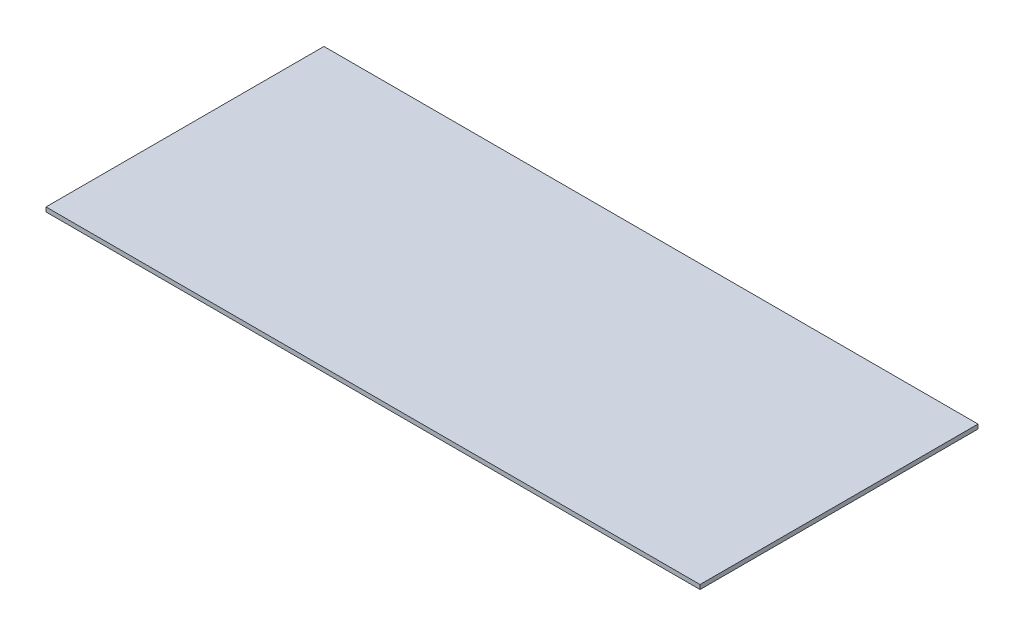
ISO-10303-21;
HEADER;
FILE_DESCRIPTION(('STEP AP214'),'2;1');
FILE_NAME('part.step','',(''),(''),'','','');
FILE_SCHEMA(('AUTOMOTIVE_DESIGN { 1 0 10303 214 1 1 1 1 }'));
ENDSEC;
DATA;
#1=APPLICATION_CONTEXT('core data for automotive mechanical design processes');
#2=APPLICATION_PROTOCOL_DEFINITION('international standard','automotive_design',2000,#1);
#3=PRODUCT_CONTEXT('',#1,'mechanical');
#4=PRODUCT('Part','Part','',(#3));
#5=PRODUCT_RELATED_PRODUCT_CATEGORY('part','',(#4));
#6=PRODUCT_DEFINITION_FORMATION('','',#4);
#7=PRODUCT_DEFINITION_CONTEXT('part definition',#1,'design');
#8=PRODUCT_DEFINITION('design','',#6,#7);
#9=PRODUCT_DEFINITION_SHAPE('','',#8);
#10=(LENGTH_UNIT() NAMED_UNIT(*) SI_UNIT(.MILLI.,.METRE.));
#11=(NAMED_UNIT(*) PLANE_ANGLE_UNIT() SI_UNIT($,.RADIAN.));
#12=(NAMED_UNIT(*) SI_UNIT($,.STERADIAN.) SOLID_ANGLE_UNIT());
#13=UNCERTAINTY_MEASURE_WITH_UNIT(LENGTH_MEASURE(1.E-05),#10,'distance_accuracy_value','');
#14=(GEOMETRIC_REPRESENTATION_CONTEXT(3) GLOBAL_UNCERTAINTY_ASSIGNED_CONTEXT((#13)) GLOBAL_UNIT_ASSIGNED_CONTEXT((#10,
#11,#12)) REPRESENTATION_CONTEXT('',''));
#15=CARTESIAN_POINT('',(0.,0.,0.));
#16=DIRECTION('',(0.,0.,1.));
#17=DIRECTION('',(1.,0.,0.));
#18=AXIS2_PLACEMENT_3D('',#15,#16,#17);
#19=CARTESIAN_POINT('',(0.,1.27,0.));
#20=DIRECTION('',(1.,0.,0.));
#21=DIRECTION('',(0.,0.,-1.));
#22=AXIS2_PLACEMENT_3D('',#19,#20,#21);
#23=PLANE('',#22);
#24=DIRECTION('',(0.,0.,1.));
#25=VECTOR('',#24,1.);
#26=CARTESIAN_POINT('',(0.,0.,0.));
#27=LINE('',#26,#25);
#28=CARTESIAN_POINT('',(0.,0.,-80.9625));
#29=VERTEX_POINT('',#28);
#30=CARTESIAN_POINT('',(0.,0.,0.));
#31=VERTEX_POINT('',#30);
#32=EDGE_CURVE('E96',#29,#31,#27,.T.);
#33=ORIENTED_EDGE('',*,*,#32,.T.);
#34=DIRECTION('',(0.,-1.,0.));
#35=VECTOR('',#34,1.);
#36=CARTESIAN_POINT('',(0.,1.27,0.));
#37=LINE('',#36,#35);
#38=CARTESIAN_POINT('',(0.,1.27,0.));
#39=VERTEX_POINT('',#38);
#40=EDGE_CURVE('E11',#39,#31,#37,.T.);
#41=ORIENTED_EDGE('',*,*,#40,.F.);
#42=DIRECTION('',(0.,0.,1.));
#43=VECTOR('',#42,1.);
#44=CARTESIAN_POINT('',(0.,1.27,0.));
#45=LINE('',#44,#43);
#46=CARTESIAN_POINT('',(0.,1.27,-80.9625));
#47=VERTEX_POINT('',#46);
#48=EDGE_CURVE('E84',#47,#39,#45,.T.);
#49=ORIENTED_EDGE('',*,*,#48,.F.);
#50=DIRECTION('',(0.,-1.,0.));
#51=VECTOR('',#50,1.);
#52=CARTESIAN_POINT('',(0.,1.27,-80.9625));
#53=LINE('',#52,#51);
#54=EDGE_CURVE('E92',#47,#29,#53,.T.);
#55=ORIENTED_EDGE('',*,*,#54,.T.);
#56=EDGE_LOOP('',(#33,#41,#49,#55));
#57=FACE_BOUND('',#56,.T.);
#58=ADVANCED_FACE('F33',(#57),#23,.F.);
#59=CARTESIAN_POINT('',(0.,1.27,0.));
#60=DIRECTION('',(0.,0.,-1.));
#61=DIRECTION('',(-1.,0.,0.));
#62=AXIS2_PLACEMENT_3D('',#59,#60,#61);
#63=PLANE('',#62);
#64=DIRECTION('',(1.,0.,0.));
#65=VECTOR('',#64,1.);
#66=CARTESIAN_POINT('',(0.,0.,0.));
#67=LINE('',#66,#65);
#68=CARTESIAN_POINT('',(190.5,0.,0.));
#69=VERTEX_POINT('',#68);
#70=EDGE_CURVE('E88',#31,#69,#67,.T.);
#71=ORIENTED_EDGE('',*,*,#70,.T.);
#72=DIRECTION('',(0.,-1.,0.));
#73=VECTOR('',#72,1.);
#74=CARTESIAN_POINT('',(190.5,1.27,0.));
#75=LINE('',#74,#73);
#76=CARTESIAN_POINT('',(190.5,1.27,0.));
#77=VERTEX_POINT('',#76);
#78=EDGE_CURVE('E41',#77,#69,#75,.T.);
#79=ORIENTED_EDGE('',*,*,#78,.F.);
#80=DIRECTION('',(1.,0.,0.));
#81=VECTOR('',#80,1.);
#82=CARTESIAN_POINT('',(0.,1.27,0.));
#83=LINE('',#82,#81);
#84=EDGE_CURVE('E79',#39,#77,#83,.T.);
#85=ORIENTED_EDGE('',*,*,#84,.F.);
#86=ORIENTED_EDGE('',*,*,#40,.T.);
#87=EDGE_LOOP('',(#71,#79,#85,#86));
#88=FACE_BOUND('',#87,.T.);
#89=ADVANCED_FACE('F87',(#88),#63,.F.);
#90=CARTESIAN_POINT('',(190.5,1.27,0.));
#91=DIRECTION('',(-1.,0.,0.));
#92=DIRECTION('',(0.,0.,1.));
#93=AXIS2_PLACEMENT_3D('',#90,#91,#92);
#94=PLANE('',#93);
#95=DIRECTION('',(0.,0.,-1.));
#96=VECTOR('',#95,1.);
#97=CARTESIAN_POINT('',(190.5,0.,0.));
#98=LINE('',#97,#96);
#99=CARTESIAN_POINT('',(190.5,0.,-80.9625));
#100=VERTEX_POINT('',#99);
#101=EDGE_CURVE('E66',#69,#100,#98,.T.);
#102=ORIENTED_EDGE('',*,*,#101,.T.);
#103=DIRECTION('',(0.,-1.,0.));
#104=VECTOR('',#103,1.);
#105=CARTESIAN_POINT('',(190.5,1.27,-80.9625));
#106=LINE('',#105,#104);
#107=CARTESIAN_POINT('',(190.5,1.27,-80.9625));
#108=VERTEX_POINT('',#107);
#109=EDGE_CURVE('E89',#108,#100,#106,.T.);
#110=ORIENTED_EDGE('',*,*,#109,.F.);
#111=DIRECTION('',(0.,0.,-1.));
#112=VECTOR('',#111,1.);
#113=CARTESIAN_POINT('',(190.5,1.27,0.));
#114=LINE('',#113,#112);
#115=EDGE_CURVE('E82',#77,#108,#114,.T.);
#116=ORIENTED_EDGE('',*,*,#115,.F.);
#117=ORIENTED_EDGE('',*,*,#78,.T.);
#118=EDGE_LOOP('',(#102,#110,#116,#117));
#119=FACE_BOUND('',#118,.T.);
#120=ADVANCED_FACE('F90',(#119),#94,.F.);
#121=CARTESIAN_POINT('',(0.,1.27,-80.9625));
#122=DIRECTION('',(0.,0.,1.));
#123=DIRECTION('',(1.,0.,0.));
#124=AXIS2_PLACEMENT_3D('',#121,#122,#123);
#125=PLANE('',#124);
#126=DIRECTION('',(-1.,0.,0.));
#127=VECTOR('',#126,1.);
#128=CARTESIAN_POINT('',(0.,0.,-80.9625));
#129=LINE('',#128,#127);
#130=EDGE_CURVE('E72',#100,#29,#129,.T.);
#131=ORIENTED_EDGE('',*,*,#130,.T.);
#132=ORIENTED_EDGE('',*,*,#54,.F.);
#133=DIRECTION('',(-1.,0.,0.));
#134=VECTOR('',#133,1.);
#135=CARTESIAN_POINT('',(0.,1.27,-80.9625));
#136=LINE('',#135,#134);
#137=EDGE_CURVE('E49',#108,#47,#136,.T.);
#138=ORIENTED_EDGE('',*,*,#137,.F.);
#139=ORIENTED_EDGE('',*,*,#109,.T.);
#140=EDGE_LOOP('',(#131,#132,#138,#139));
#141=FACE_BOUND('',#140,.T.);
#142=ADVANCED_FACE('F103',(#141),#125,.F.);
#143=CARTESIAN_POINT('',(0.,1.27,0.));
#144=DIRECTION('',(0.,-1.,0.));
#145=DIRECTION('',(0.,0.,-1.));
#146=AXIS2_PLACEMENT_3D('',#143,#144,#145);
#147=PLANE('',#146);
#148=ORIENTED_EDGE('',*,*,#48,.T.);
#149=ORIENTED_EDGE('',*,*,#84,.T.);
#150=ORIENTED_EDGE('',*,*,#115,.T.);
#151=ORIENTED_EDGE('',*,*,#137,.T.);
#152=EDGE_LOOP('',(#148,#149,#150,#151));
#153=FACE_BOUND('',#152,.T.);
#154=ADVANCED_FACE('F80',(#153),#147,.F.);
#155=CARTESIAN_POINT('',(0.,0.,0.));
#156=DIRECTION('',(0.,-1.,0.));
#157=DIRECTION('',(0.,0.,-1.));
#158=AXIS2_PLACEMENT_3D('',#155,#156,#157);
#159=PLANE('',#158);
#160=ORIENTED_EDGE('',*,*,#32,.F.);
#161=ORIENTED_EDGE('',*,*,#130,.F.);
#162=ORIENTED_EDGE('',*,*,#101,.F.);
#163=ORIENTED_EDGE('',*,*,#70,.F.);
#164=EDGE_LOOP('',(#160,#161,#162,#163));
#165=FACE_BOUND('',#164,.T.);
#166=ADVANCED_FACE('F106',(#165),#159,.T.);
#167=CLOSED_SHELL('',(#58,#89,#120,#142,#154,#166));
#168=MANIFOLD_SOLID_BREP('B2',#167);
#169=ADVANCED_BREP_SHAPE_REPRESENTATION('',(#18,#168),#14);
#170=SHAPE_DEFINITION_REPRESENTATION(#9,#169);
ENDSEC;
END-ISO-10303-21;
